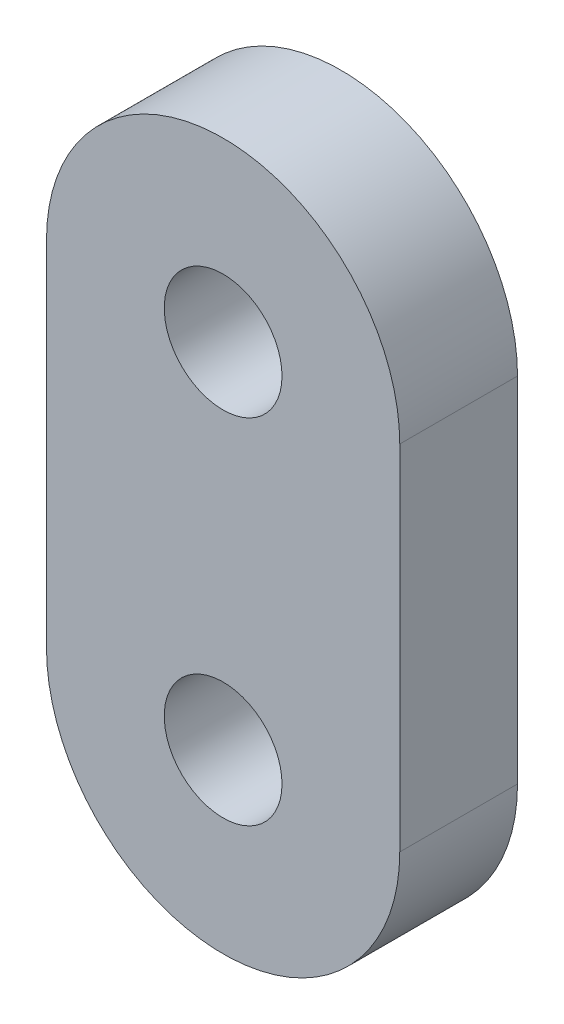
ISO-10303-21;
HEADER;
FILE_DESCRIPTION(('STEP AP214'),'2;1');
FILE_NAME('part.step','',(''),(''),'','','');
FILE_SCHEMA(('AUTOMOTIVE_DESIGN { 1 0 10303 214 1 1 1 1 }'));
ENDSEC;
DATA;
#1=APPLICATION_CONTEXT('core data for automotive mechanical design processes');
#2=APPLICATION_PROTOCOL_DEFINITION('international standard','automotive_design',2000,#1);
#3=PRODUCT_CONTEXT('',#1,'mechanical');
#4=PRODUCT('Part','Part','',(#3));
#5=PRODUCT_RELATED_PRODUCT_CATEGORY('part','',(#4));
#6=PRODUCT_DEFINITION_FORMATION('','',#4);
#7=PRODUCT_DEFINITION_CONTEXT('part definition',#1,'design');
#8=PRODUCT_DEFINITION('design','',#6,#7);
#9=PRODUCT_DEFINITION_SHAPE('','',#8);
#10=(LENGTH_UNIT() NAMED_UNIT(*) SI_UNIT(.MILLI.,.METRE.));
#11=(NAMED_UNIT(*) PLANE_ANGLE_UNIT() SI_UNIT($,.RADIAN.));
#12=(NAMED_UNIT(*) SI_UNIT($,.STERADIAN.) SOLID_ANGLE_UNIT());
#13=UNCERTAINTY_MEASURE_WITH_UNIT(LENGTH_MEASURE(1.E-05),#10,'distance_accuracy_value','');
#14=(GEOMETRIC_REPRESENTATION_CONTEXT(3) GLOBAL_UNCERTAINTY_ASSIGNED_CONTEXT((#13)) GLOBAL_UNIT_ASSIGNED_CONTEXT((#10,
#11,#12)) REPRESENTATION_CONTEXT('',''));
#15=CARTESIAN_POINT('',(0.,0.,0.));
#16=DIRECTION('',(0.,0.,1.));
#17=DIRECTION('',(1.,0.,0.));
#18=AXIS2_PLACEMENT_3D('',#15,#16,#17);
#19=CARTESIAN_POINT('',(208.7507761496,152.428489513,3.));
#20=DIRECTION('',(0.,0.,1.));
#21=DIRECTION('',(1.,0.,0.));
#22=AXIS2_PLACEMENT_3D('',#19,#20,#21);
#23=PLANE('',#22);
#24=CARTESIAN_POINT('',(208.7507761496,152.428489513,3.));
#25=DIRECTION('',(0.,0.,1.));
#26=DIRECTION('',(1.,0.,0.));
#27=AXIS2_PLACEMENT_3D('',#24,#25,#26);
#28=CIRCLE('',#27,1.5);
#29=CARTESIAN_POINT('',(210.2507761496,152.428489513,3.));
#30=VERTEX_POINT('',#29);
#31=EDGE_CURVE('E100',#30,#30,#28,.T.);
#32=ORIENTED_EDGE('',*,*,#31,.F.);
#33=EDGE_LOOP('',(#32));
#34=FACE_BOUND('',#33,.T.);
#35=CARTESIAN_POINT('',(208.7507761496,152.428489513,3.));
#36=DIRECTION('',(0.,0.,1.));
#37=DIRECTION('',(1.,0.,0.));
#38=AXIS2_PLACEMENT_3D('',#35,#36,#37);
#39=CIRCLE('',#38,4.5);
#40=CARTESIAN_POINT('',(204.2507761496,152.428489513,3.));
#41=VERTEX_POINT('',#40);
#42=CARTESIAN_POINT('',(213.2507761496,152.428489513,3.));
#43=VERTEX_POINT('',#42);
#44=EDGE_CURVE('E85',#41,#43,#39,.T.);
#45=ORIENTED_EDGE('',*,*,#44,.T.);
#46=DIRECTION('',(0.,1.,0.));
#47=VECTOR('',#46,1.);
#48=CARTESIAN_POINT('',(213.2507761496,152.428489513,3.));
#49=LINE('',#48,#47);
#50=CARTESIAN_POINT('',(213.2507761496,161.428489513,3.));
#51=VERTEX_POINT('',#50);
#52=EDGE_CURVE('E80',#43,#51,#49,.T.);
#53=ORIENTED_EDGE('',*,*,#52,.T.);
#54=CARTESIAN_POINT('',(208.7507761496,161.428489513,3.));
#55=DIRECTION('',(0.,0.,1.));
#56=DIRECTION('',(1.,0.,0.));
#57=AXIS2_PLACEMENT_3D('',#54,#55,#56);
#58=CIRCLE('',#57,4.5);
#59=CARTESIAN_POINT('',(204.2507761496,161.428489513,3.));
#60=VERTEX_POINT('',#59);
#61=EDGE_CURVE('E83',#51,#60,#58,.T.);
#62=ORIENTED_EDGE('',*,*,#61,.T.);
#63=DIRECTION('',(0.,-1.,0.));
#64=VECTOR('',#63,1.);
#65=CARTESIAN_POINT('',(204.2507761496,161.428489513,3.));
#66=LINE('',#65,#64);
#67=EDGE_CURVE('E50',#60,#41,#66,.T.);
#68=ORIENTED_EDGE('',*,*,#67,.T.);
#69=EDGE_LOOP('',(#45,#53,#62,#68));
#70=FACE_BOUND('',#69,.T.);
#71=CARTESIAN_POINT('',(208.7507761496,161.428489513,3.));
#72=DIRECTION('',(0.,0.,1.));
#73=DIRECTION('',(1.,0.,0.));
#74=AXIS2_PLACEMENT_3D('',#71,#72,#73);
#75=CIRCLE('',#74,1.5);
#76=CARTESIAN_POINT('',(210.2507761496,161.428489513,3.));
#77=VERTEX_POINT('',#76);
#78=EDGE_CURVE('E115',#77,#77,#75,.T.);
#79=ORIENTED_EDGE('',*,*,#78,.F.);
#80=EDGE_LOOP('',(#79));
#81=FACE_BOUND('',#80,.T.);
#82=ADVANCED_FACE('F33',(#34,#70,#81),#23,.T.);
#83=CARTESIAN_POINT('',(208.7507761496,152.428489513,0.));
#84=DIRECTION('',(0.,0.,1.));
#85=DIRECTION('',(1.,0.,0.));
#86=AXIS2_PLACEMENT_3D('',#83,#84,#85);
#87=PLANE('',#86);
#88=CARTESIAN_POINT('',(208.7507761496,152.428489513,0.));
#89=DIRECTION('',(0.,0.,1.));
#90=DIRECTION('',(1.,0.,0.));
#91=AXIS2_PLACEMENT_3D('',#88,#89,#90);
#92=CIRCLE('',#91,1.5);
#93=CARTESIAN_POINT('',(210.2507761496,152.428489513,0.));
#94=VERTEX_POINT('',#93);
#95=EDGE_CURVE('E112',#94,#94,#92,.T.);
#96=ORIENTED_EDGE('',*,*,#95,.T.);
#97=EDGE_LOOP('',(#96));
#98=FACE_BOUND('',#97,.T.);
#99=CARTESIAN_POINT('',(208.7507761496,152.428489513,0.));
#100=DIRECTION('',(0.,0.,1.));
#101=DIRECTION('',(1.,0.,0.));
#102=AXIS2_PLACEMENT_3D('',#99,#100,#101);
#103=CIRCLE('',#102,4.5);
#104=CARTESIAN_POINT('',(204.2507761496,152.428489513,0.));
#105=VERTEX_POINT('',#104);
#106=CARTESIAN_POINT('',(213.2507761496,152.428489513,0.));
#107=VERTEX_POINT('',#106);
#108=EDGE_CURVE('E97',#105,#107,#103,.T.);
#109=ORIENTED_EDGE('',*,*,#108,.F.);
#110=DIRECTION('',(0.,-1.,0.));
#111=VECTOR('',#110,1.);
#112=CARTESIAN_POINT('',(204.2507761496,161.428489513,0.));
#113=LINE('',#112,#111);
#114=CARTESIAN_POINT('',(204.2507761496,161.428489513,0.));
#115=VERTEX_POINT('',#114);
#116=EDGE_CURVE('E73',#115,#105,#113,.T.);
#117=ORIENTED_EDGE('',*,*,#116,.F.);
#118=CARTESIAN_POINT('',(208.7507761496,161.428489513,0.));
#119=DIRECTION('',(0.,0.,1.));
#120=DIRECTION('',(1.,0.,0.));
#121=AXIS2_PLACEMENT_3D('',#118,#119,#120);
#122=CIRCLE('',#121,4.5);
#123=CARTESIAN_POINT('',(213.2507761496,161.428489513,0.));
#124=VERTEX_POINT('',#123);
#125=EDGE_CURVE('E67',#124,#115,#122,.T.);
#126=ORIENTED_EDGE('',*,*,#125,.F.);
#127=DIRECTION('',(0.,1.,0.));
#128=VECTOR('',#127,1.);
#129=CARTESIAN_POINT('',(213.2507761496,152.428489513,0.));
#130=LINE('',#129,#128);
#131=EDGE_CURVE('E89',#107,#124,#130,.T.);
#132=ORIENTED_EDGE('',*,*,#131,.F.);
#133=EDGE_LOOP('',(#109,#117,#126,#132));
#134=FACE_BOUND('',#133,.T.);
#135=CARTESIAN_POINT('',(208.7507761496,161.428489513,0.));
#136=DIRECTION('',(0.,0.,1.));
#137=DIRECTION('',(1.,0.,0.));
#138=AXIS2_PLACEMENT_3D('',#135,#136,#137);
#139=CIRCLE('',#138,1.5);
#140=CARTESIAN_POINT('',(210.2507761496,161.428489513,0.));
#141=VERTEX_POINT('',#140);
#142=EDGE_CURVE('E118',#141,#141,#139,.T.);
#143=ORIENTED_EDGE('',*,*,#142,.T.);
#144=EDGE_LOOP('',(#143));
#145=FACE_BOUND('',#144,.T.);
#146=ADVANCED_FACE('F108',(#98,#134,#145),#87,.F.);
#147=CARTESIAN_POINT('',(208.7507761496,152.428489513,3.));
#148=DIRECTION('',(0.,0.,-1.));
#149=DIRECTION('',(-1.,0.,0.));
#150=AXIS2_PLACEMENT_3D('',#147,#148,#149);
#151=CYLINDRICAL_SURFACE('',#150,4.5);
#152=ORIENTED_EDGE('',*,*,#108,.T.);
#153=DIRECTION('',(0.,0.,-1.));
#154=VECTOR('',#153,1.);
#155=CARTESIAN_POINT('',(213.2507761496,152.428489513,3.));
#156=LINE('',#155,#154);
#157=EDGE_CURVE('E11',#43,#107,#156,.T.);
#158=ORIENTED_EDGE('',*,*,#157,.F.);
#159=ORIENTED_EDGE('',*,*,#44,.F.);
#160=DIRECTION('',(0.,0.,-1.));
#161=VECTOR('',#160,1.);
#162=CARTESIAN_POINT('',(204.2507761496,152.428489513,3.));
#163=LINE('',#162,#161);
#164=EDGE_CURVE('E93',#41,#105,#163,.T.);
#165=ORIENTED_EDGE('',*,*,#164,.T.);
#166=EDGE_LOOP('',(#152,#158,#159,#165));
#167=FACE_BOUND('',#166,.T.);
#168=ADVANCED_FACE('F35',(#167),#151,.T.);
#169=CARTESIAN_POINT('',(213.2507761496,152.428489513,3.));
#170=DIRECTION('',(-1.,0.,0.));
#171=DIRECTION('',(0.,0.,1.));
#172=AXIS2_PLACEMENT_3D('',#169,#170,#171);
#173=PLANE('',#172);
#174=ORIENTED_EDGE('',*,*,#131,.T.);
#175=DIRECTION('',(0.,0.,-1.));
#176=VECTOR('',#175,1.);
#177=CARTESIAN_POINT('',(213.2507761496,161.428489513,3.));
#178=LINE('',#177,#176);
#179=EDGE_CURVE('E42',#51,#124,#178,.T.);
#180=ORIENTED_EDGE('',*,*,#179,.F.);
#181=ORIENTED_EDGE('',*,*,#52,.F.);
#182=ORIENTED_EDGE('',*,*,#157,.T.);
#183=EDGE_LOOP('',(#174,#180,#181,#182));
#184=FACE_BOUND('',#183,.T.);
#185=ADVANCED_FACE('F88',(#184),#173,.F.);
#186=CARTESIAN_POINT('',(208.7507761496,161.428489513,3.));
#187=DIRECTION('',(0.,0.,-1.));
#188=DIRECTION('',(-1.,0.,0.));
#189=AXIS2_PLACEMENT_3D('',#186,#187,#188);
#190=CYLINDRICAL_SURFACE('',#189,4.5);
#191=ORIENTED_EDGE('',*,*,#125,.T.);
#192=DIRECTION('',(0.,0.,-1.));
#193=VECTOR('',#192,1.);
#194=CARTESIAN_POINT('',(204.2507761496,161.428489513,3.));
#195=LINE('',#194,#193);
#196=EDGE_CURVE('E90',#60,#115,#195,.T.);
#197=ORIENTED_EDGE('',*,*,#196,.F.);
#198=ORIENTED_EDGE('',*,*,#61,.F.);
#199=ORIENTED_EDGE('',*,*,#179,.T.);
#200=EDGE_LOOP('',(#191,#197,#198,#199));
#201=FACE_BOUND('',#200,.T.);
#202=ADVANCED_FACE('F91',(#201),#190,.T.);
#203=CARTESIAN_POINT('',(204.2507761496,161.428489513,3.));
#204=DIRECTION('',(1.,0.,0.));
#205=DIRECTION('',(0.,0.,-1.));
#206=AXIS2_PLACEMENT_3D('',#203,#204,#205);
#207=PLANE('',#206);
#208=ORIENTED_EDGE('',*,*,#116,.T.);
#209=ORIENTED_EDGE('',*,*,#164,.F.);
#210=ORIENTED_EDGE('',*,*,#67,.F.);
#211=ORIENTED_EDGE('',*,*,#196,.T.);
#212=EDGE_LOOP('',(#208,#209,#210,#211));
#213=FACE_BOUND('',#212,.T.);
#214=ADVANCED_FACE('F105',(#213),#207,.F.);
#215=CARTESIAN_POINT('',(208.7507761496,152.428489513,3.));
#216=DIRECTION('',(0.,0.,-1.));
#217=DIRECTION('',(-1.,0.,0.));
#218=AXIS2_PLACEMENT_3D('',#215,#216,#217);
#219=CYLINDRICAL_SURFACE('',#218,1.5);
#220=ORIENTED_EDGE('',*,*,#31,.T.);
#221=EDGE_LOOP('',(#220));
#222=FACE_BOUND('',#221,.T.);
#223=ORIENTED_EDGE('',*,*,#95,.F.);
#224=EDGE_LOOP('',(#223));
#225=FACE_BOUND('',#224,.T.);
#226=ADVANCED_FACE('F136',(#222,#225),#219,.F.);
#227=CARTESIAN_POINT('',(208.7507761496,161.428489513,3.));
#228=DIRECTION('',(0.,0.,-1.));
#229=DIRECTION('',(-1.,0.,0.));
#230=AXIS2_PLACEMENT_3D('',#227,#228,#229);
#231=CYLINDRICAL_SURFACE('',#230,1.5);
#232=ORIENTED_EDGE('',*,*,#78,.T.);
#233=EDGE_LOOP('',(#232));
#234=FACE_BOUND('',#233,.T.);
#235=ORIENTED_EDGE('',*,*,#142,.F.);
#236=EDGE_LOOP('',(#235));
#237=FACE_BOUND('',#236,.T.);
#238=ADVANCED_FACE('F124',(#234,#237),#231,.F.);
#239=CLOSED_SHELL('',(#82,#146,#168,#185,#202,#214,#226,#238));
#240=MANIFOLD_SOLID_BREP('B2',#239);
#241=ADVANCED_BREP_SHAPE_REPRESENTATION('',(#18,#240),#14);
#242=SHAPE_DEFINITION_REPRESENTATION(#9,#241);
ENDSEC;
END-ISO-10303-21;
